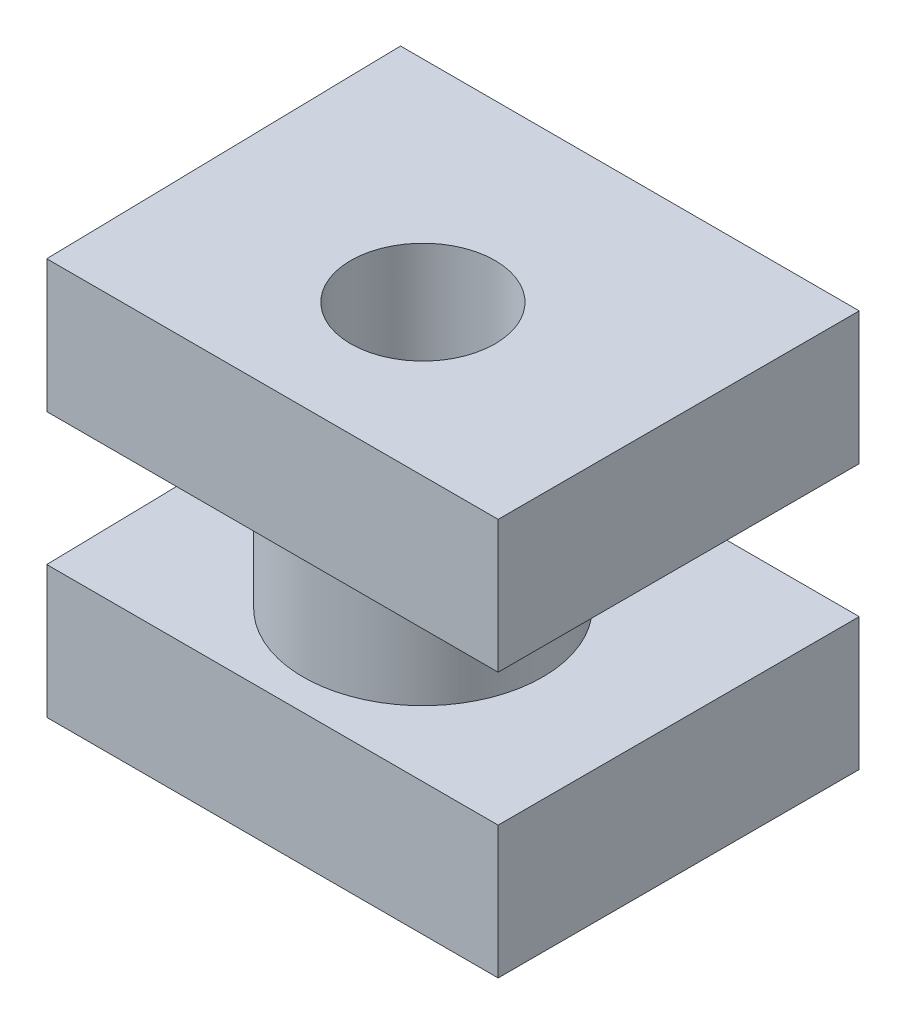
ISO-10303-21;
HEADER;
FILE_DESCRIPTION(('STEP AP214'),'2;1');
FILE_NAME('part.step','',(''),(''),'','','');
FILE_SCHEMA(('AUTOMOTIVE_DESIGN { 1 0 10303 214 1 1 1 1 }'));
ENDSEC;
DATA;
#1=APPLICATION_CONTEXT('core data for automotive mechanical design processes');
#2=APPLICATION_PROTOCOL_DEFINITION('international standard','automotive_design',2000,#1);
#3=PRODUCT_CONTEXT('',#1,'mechanical');
#4=PRODUCT('Part','Part','',(#3));
#5=PRODUCT_RELATED_PRODUCT_CATEGORY('part','',(#4));
#6=PRODUCT_DEFINITION_FORMATION('','',#4);
#7=PRODUCT_DEFINITION_CONTEXT('part definition',#1,'design');
#8=PRODUCT_DEFINITION('design','',#6,#7);
#9=PRODUCT_DEFINITION_SHAPE('','',#8);
#10=(LENGTH_UNIT() NAMED_UNIT(*) SI_UNIT(.MILLI.,.METRE.));
#11=(NAMED_UNIT(*) PLANE_ANGLE_UNIT() SI_UNIT($,.RADIAN.));
#12=(NAMED_UNIT(*) SI_UNIT($,.STERADIAN.) SOLID_ANGLE_UNIT());
#13=UNCERTAINTY_MEASURE_WITH_UNIT(LENGTH_MEASURE(1.E-05),#10,'distance_accuracy_value','');
#14=(GEOMETRIC_REPRESENTATION_CONTEXT(3) GLOBAL_UNCERTAINTY_ASSIGNED_CONTEXT((#13)) GLOBAL_UNIT_ASSIGNED_CONTEXT((#10,
#11,#12)) REPRESENTATION_CONTEXT('',''));
#15=CARTESIAN_POINT('',(0.,0.,0.));
#16=DIRECTION('',(0.,0.,1.));
#17=DIRECTION('',(1.,0.,0.));
#18=AXIS2_PLACEMENT_3D('',#15,#16,#17);
#19=CARTESIAN_POINT('',(-3.9175,2.2,0.252655339965529));
#20=DIRECTION('',(0.,-1.,0.));
#21=DIRECTION('',(0.,0.,-1.));
#22=AXIS2_PLACEMENT_3D('',#19,#20,#21);
#23=CYLINDRICAL_SURFACE('',#22,1.99);
#24=CARTESIAN_POINT('',(-3.9175,0.,0.252655339965529));
#25=DIRECTION('',(0.,1.,0.));
#26=DIRECTION('',(0.,0.,1.));
#27=AXIS2_PLACEMENT_3D('',#24,#25,#26);
#28=CIRCLE('',#27,1.99);
#29=CARTESIAN_POINT('',(-5.035,0.,-1.39394532504102));
#30=VERTEX_POINT('',#29);
#31=CARTESIAN_POINT('',(-2.8,0.,-1.39394532504102));
#32=VERTEX_POINT('',#31);
#33=EDGE_CURVE('E208',#30,#32,#28,.T.);
#34=ORIENTED_EDGE('',*,*,#33,.T.);
#35=DIRECTION('',(0.,-1.,0.));
#36=VECTOR('',#35,1.);
#37=CARTESIAN_POINT('',(-2.8,2.2,-1.39394532504102));
#38=LINE('',#37,#36);
#39=CARTESIAN_POINT('',(-2.8,2.2,-1.39394532504102));
#40=VERTEX_POINT('',#39);
#41=EDGE_CURVE('E11',#40,#32,#38,.T.);
#42=ORIENTED_EDGE('',*,*,#41,.F.);
#43=CARTESIAN_POINT('',(-3.9175,2.2,0.252655339965529));
#44=DIRECTION('',(0.,1.,0.));
#45=DIRECTION('',(0.,0.,1.));
#46=AXIS2_PLACEMENT_3D('',#43,#44,#45);
#47=CIRCLE('',#46,1.99);
#48=CARTESIAN_POINT('',(-5.035,2.2,-1.39394532504102));
#49=VERTEX_POINT('',#48);
#50=EDGE_CURVE('E233',#49,#40,#47,.T.);
#51=ORIENTED_EDGE('',*,*,#50,.F.);
#52=DIRECTION('',(0.,-1.,0.));
#53=VECTOR('',#52,1.);
#54=CARTESIAN_POINT('',(-5.035,2.2,-1.39394532504102));
#55=LINE('',#54,#53);
#56=EDGE_CURVE('E211',#49,#30,#55,.T.);
#57=ORIENTED_EDGE('',*,*,#56,.T.);
#58=EDGE_LOOP('',(#34,#42,#51,#57));
#59=FACE_BOUND('',#58,.T.);
#60=ADVANCED_FACE('F34',(#59),#23,.T.);
#61=CARTESIAN_POINT('',(-2.8,2.2,-3.24734466003447));
#62=DIRECTION('',(-1.,0.,0.));
#63=DIRECTION('',(0.,0.,1.));
#64=AXIS2_PLACEMENT_3D('',#61,#62,#63);
#65=PLANE('',#64);
#66=DIRECTION('',(0.,0.,-1.));
#67=VECTOR('',#66,1.);
#68=CARTESIAN_POINT('',(-2.8,0.,-3.24734466003447));
#69=LINE('',#68,#67);
#70=CARTESIAN_POINT('',(-2.8,0.,-3.24734466003447));
#71=VERTEX_POINT('',#70);
#72=EDGE_CURVE('E214',#32,#71,#69,.T.);
#73=ORIENTED_EDGE('',*,*,#72,.T.);
#74=DIRECTION('',(0.,-1.,0.));
#75=VECTOR('',#74,1.);
#76=CARTESIAN_POINT('',(-2.8,2.2,-3.24734466003447));
#77=LINE('',#76,#75);
#78=CARTESIAN_POINT('',(-2.8,2.2,-3.24734466003447));
#79=VERTEX_POINT('',#78);
#80=EDGE_CURVE('E44',#79,#71,#77,.T.);
#81=ORIENTED_EDGE('',*,*,#80,.F.);
#82=DIRECTION('',(0.,0.,-1.));
#83=VECTOR('',#82,1.);
#84=CARTESIAN_POINT('',(-2.8,2.2,-3.24734466003447));
#85=LINE('',#84,#83);
#86=EDGE_CURVE('E37',#40,#79,#85,.T.);
#87=ORIENTED_EDGE('',*,*,#86,.F.);
#88=ORIENTED_EDGE('',*,*,#41,.T.);
#89=EDGE_LOOP('',(#73,#81,#87,#88));
#90=FACE_BOUND('',#89,.T.);
#91=ADVANCED_FACE('F199',(#90),#65,.F.);
#92=CARTESIAN_POINT('',(-5.035,2.2,-3.24734466003447));
#93=DIRECTION('',(0.,0.,1.));
#94=DIRECTION('',(1.,0.,0.));
#95=AXIS2_PLACEMENT_3D('',#92,#93,#94);
#96=PLANE('',#95);
#97=ORIENTED_EDGE('',*,*,#80,.T.);
#98=DIRECTION('',(1.,0.,0.));
#99=VECTOR('',#98,1.);
#100=CARTESIAN_POINT('',(-3.9175,0.,-3.24734466003447));
#101=LINE('',#100,#99);
#102=CARTESIAN_POINT('',(-0.167500000000001,0.,-3.24734466003447));
#103=VERTEX_POINT('',#102);
#104=EDGE_CURVE('E150',#71,#103,#101,.T.);
#105=ORIENTED_EDGE('',*,*,#104,.T.);
#106=DIRECTION('',(0.,1.,0.));
#107=VECTOR('',#106,1.);
#108=CARTESIAN_POINT('',(-0.167500000000001,-2.2,-3.24734466003447));
#109=LINE('',#108,#107);
#110=CARTESIAN_POINT('',(-0.167500000000001,-2.2,-3.24734466003447));
#111=VERTEX_POINT('',#110);
#112=EDGE_CURVE('E215',#111,#103,#109,.T.);
#113=ORIENTED_EDGE('',*,*,#112,.F.);
#114=DIRECTION('',(1.,0.,0.));
#115=VECTOR('',#114,1.);
#116=CARTESIAN_POINT('',(-3.9175,-2.2,-3.24734466003447));
#117=LINE('',#116,#115);
#118=CARTESIAN_POINT('',(-7.78986155746163,-2.2,-3.24734466003447));
#119=VERTEX_POINT('',#118);
#120=EDGE_CURVE('E261',#119,#111,#117,.T.);
#121=ORIENTED_EDGE('',*,*,#120,.F.);
#122=DIRECTION('',(0.,1.,0.));
#123=VECTOR('',#122,1.);
#124=CARTESIAN_POINT('',(-7.78986155746163,-2.2,-3.24734466003447));
#125=LINE('',#124,#123);
#126=CARTESIAN_POINT('',(-7.78986155746163,0.,-3.24734466003447));
#127=VERTEX_POINT('',#126);
#128=EDGE_CURVE('E262',#119,#127,#125,.T.);
#129=ORIENTED_EDGE('',*,*,#128,.T.);
#130=CARTESIAN_POINT('',(-5.035,0.,-3.24734466003447));
#131=VERTEX_POINT('',#130);
#132=EDGE_CURVE('E247',#127,#131,#101,.T.);
#133=ORIENTED_EDGE('',*,*,#132,.T.);
#134=DIRECTION('',(0.,-1.,0.));
#135=VECTOR('',#134,1.);
#136=CARTESIAN_POINT('',(-5.035,2.2,-3.24734466003447));
#137=LINE('',#136,#135);
#138=CARTESIAN_POINT('',(-5.035,2.2,-3.24734466003447));
#139=VERTEX_POINT('',#138);
#140=EDGE_CURVE('E52',#139,#131,#137,.T.);
#141=ORIENTED_EDGE('',*,*,#140,.F.);
#142=DIRECTION('',(-1.,0.,0.));
#143=VECTOR('',#142,1.);
#144=CARTESIAN_POINT('',(-7.78986155746163,2.2,-3.24734466003447));
#145=LINE('',#144,#143);
#146=CARTESIAN_POINT('',(-7.78986155746163,2.2,-3.24734466003447));
#147=VERTEX_POINT('',#146);
#148=EDGE_CURVE('E159',#139,#147,#145,.T.);
#149=ORIENTED_EDGE('',*,*,#148,.T.);
#150=DIRECTION('',(0.,-1.,0.));
#151=VECTOR('',#150,1.);
#152=CARTESIAN_POINT('',(-7.78986155746163,4.4,-3.24734466003447));
#153=LINE('',#152,#151);
#154=CARTESIAN_POINT('',(-7.78986155746163,4.4,-3.24734466003447));
#155=VERTEX_POINT('',#154);
#156=EDGE_CURVE('E165',#155,#147,#153,.T.);
#157=ORIENTED_EDGE('',*,*,#156,.F.);
#158=DIRECTION('',(-1.,0.,0.));
#159=VECTOR('',#158,1.);
#160=CARTESIAN_POINT('',(-2.8,4.4,-3.24734466003447));
#161=LINE('',#160,#159);
#162=CARTESIAN_POINT('',(-0.167500000000001,4.4,-3.24734466003447));
#163=VERTEX_POINT('',#162);
#164=EDGE_CURVE('E138',#163,#155,#161,.T.);
#165=ORIENTED_EDGE('',*,*,#164,.F.);
#166=DIRECTION('',(0.,-1.,0.));
#167=VECTOR('',#166,1.);
#168=CARTESIAN_POINT('',(-0.167500000000001,4.4,-3.24734466003447));
#169=LINE('',#168,#167);
#170=CARTESIAN_POINT('',(-0.167500000000001,2.2,-3.24734466003447));
#171=VERTEX_POINT('',#170);
#172=EDGE_CURVE('E152',#163,#171,#169,.T.);
#173=ORIENTED_EDGE('',*,*,#172,.T.);
#174=EDGE_CURVE('E142',#171,#79,#145,.T.);
#175=ORIENTED_EDGE('',*,*,#174,.T.);
#176=EDGE_LOOP('',(#97,#105,#113,#121,#129,#133,#141,#149,#157,#165,#173,#175));
#177=FACE_BOUND('',#176,.T.);
#178=ADVANCED_FACE('F170',(#177),#96,.F.);
#179=CARTESIAN_POINT('',(-5.035,2.2,-1.39394532504102));
#180=DIRECTION('',(1.,0.,0.));
#181=DIRECTION('',(0.,0.,-1.));
#182=AXIS2_PLACEMENT_3D('',#179,#180,#181);
#183=PLANE('',#182);
#184=DIRECTION('',(0.,0.,1.));
#185=VECTOR('',#184,1.);
#186=CARTESIAN_POINT('',(-5.035,0.,-1.39394532504102));
#187=LINE('',#186,#185);
#188=EDGE_CURVE('E218',#131,#30,#187,.T.);
#189=ORIENTED_EDGE('',*,*,#188,.T.);
#190=ORIENTED_EDGE('',*,*,#56,.F.);
#191=DIRECTION('',(0.,0.,1.));
#192=VECTOR('',#191,1.);
#193=CARTESIAN_POINT('',(-5.035,2.2,-1.39394532504102));
#194=LINE('',#193,#192);
#195=EDGE_CURVE('E239',#139,#49,#194,.T.);
#196=ORIENTED_EDGE('',*,*,#195,.F.);
#197=ORIENTED_EDGE('',*,*,#140,.T.);
#198=EDGE_LOOP('',(#189,#190,#196,#197));
#199=FACE_BOUND('',#198,.T.);
#200=ADVANCED_FACE('F297',(#199),#183,.F.);
#201=CARTESIAN_POINT('',(-3.9175,2.2,0.252655339965529));
#202=DIRECTION('',(0.,-1.,0.));
#203=DIRECTION('',(0.,0.,-1.));
#204=AXIS2_PLACEMENT_3D('',#201,#202,#203);
#205=CYLINDRICAL_SURFACE('',#204,1.2);
#206=CARTESIAN_POINT('',(-3.9175,-2.2,0.252655339965529));
#207=DIRECTION('',(0.,-1.,0.));
#208=DIRECTION('',(0.,0.,-1.));
#209=AXIS2_PLACEMENT_3D('',#206,#207,#208);
#210=CIRCLE('',#209,1.2);
#211=CARTESIAN_POINT('',(-3.9175,-2.2,-0.947344660034471));
#212=VERTEX_POINT('',#211);
#213=EDGE_CURVE('E147',#212,#212,#210,.T.);
#214=ORIENTED_EDGE('',*,*,#213,.T.);
#215=EDGE_LOOP('',(#214));
#216=FACE_BOUND('',#215,.T.);
#217=CARTESIAN_POINT('',(-3.9175,4.4,0.252655339965529));
#218=DIRECTION('',(0.,1.,0.));
#219=DIRECTION('',(0.,0.,1.));
#220=AXIS2_PLACEMENT_3D('',#217,#218,#219);
#221=CIRCLE('',#220,1.2);
#222=CARTESIAN_POINT('',(-3.9175,4.4,1.45265533996553));
#223=VERTEX_POINT('',#222);
#224=EDGE_CURVE('E177',#223,#223,#221,.T.);
#225=ORIENTED_EDGE('',*,*,#224,.T.);
#226=EDGE_LOOP('',(#225));
#227=FACE_BOUND('',#226,.T.);
#228=ADVANCED_FACE('F185',(#216,#227),#205,.F.);
#229=CARTESIAN_POINT('',(0.,0.,0.));
#230=DIRECTION('',(0.,1.,0.));
#231=DIRECTION('',(0.,0.,1.));
#232=AXIS2_PLACEMENT_3D('',#229,#230,#231);
#233=PLANE('',#232);
#234=ORIENTED_EDGE('',*,*,#188,.F.);
#235=ORIENTED_EDGE('',*,*,#132,.F.);
#236=DIRECTION('',(-0.0203893533989371,0.,-0.999792115526009));
#237=VECTOR('',#236,1.);
#238=CARTESIAN_POINT('',(-7.6675,0.,2.75265533996553));
#239=LINE('',#238,#237);
#240=CARTESIAN_POINT('',(-7.6675,0.,2.75265533996553));
#241=VERTEX_POINT('',#240);
#242=EDGE_CURVE('E258',#241,#127,#239,.T.);
#243=ORIENTED_EDGE('',*,*,#242,.F.);
#244=DIRECTION('',(-1.,0.,0.));
#245=VECTOR('',#244,1.);
#246=CARTESIAN_POINT('',(-0.167500000000001,0.,2.75265533996553));
#247=LINE('',#246,#245);
#248=CARTESIAN_POINT('',(-0.167500000000001,0.,2.75265533996553));
#249=VERTEX_POINT('',#248);
#250=EDGE_CURVE('E256',#249,#241,#247,.T.);
#251=ORIENTED_EDGE('',*,*,#250,.F.);
#252=DIRECTION('',(0.,0.,1.));
#253=VECTOR('',#252,1.);
#254=CARTESIAN_POINT('',(-0.167500000000001,0.,-3.24734466003447));
#255=LINE('',#254,#253);
#256=EDGE_CURVE('E253',#103,#249,#255,.T.);
#257=ORIENTED_EDGE('',*,*,#256,.F.);
#258=ORIENTED_EDGE('',*,*,#104,.F.);
#259=ORIENTED_EDGE('',*,*,#72,.F.);
#260=ORIENTED_EDGE('',*,*,#33,.F.);
#261=EDGE_LOOP('',(#234,#235,#243,#251,#257,#258,#259,#260));
#262=FACE_BOUND('',#261,.T.);
#263=ADVANCED_FACE('F279',(#262),#233,.T.);
#264=CARTESIAN_POINT('',(0.,-2.2,0.));
#265=DIRECTION('',(0.,1.,0.));
#266=DIRECTION('',(0.,0.,1.));
#267=AXIS2_PLACEMENT_3D('',#264,#265,#266);
#268=PLANE('',#267);
#269=ORIENTED_EDGE('',*,*,#120,.T.);
#270=DIRECTION('',(0.,0.,1.));
#271=VECTOR('',#270,1.);
#272=CARTESIAN_POINT('',(-0.167500000000001,-2.2,-3.24734466003447));
#273=LINE('',#272,#271);
#274=CARTESIAN_POINT('',(-0.167500000000001,-2.2,2.75265533996553));
#275=VERTEX_POINT('',#274);
#276=EDGE_CURVE('E286',#111,#275,#273,.T.);
#277=ORIENTED_EDGE('',*,*,#276,.T.);
#278=DIRECTION('',(-1.,0.,0.));
#279=VECTOR('',#278,1.);
#280=CARTESIAN_POINT('',(-0.167500000000001,-2.2,2.75265533996553));
#281=LINE('',#280,#279);
#282=CARTESIAN_POINT('',(-7.6675,-2.2,2.75265533996553));
#283=VERTEX_POINT('',#282);
#284=EDGE_CURVE('E274',#275,#283,#281,.T.);
#285=ORIENTED_EDGE('',*,*,#284,.T.);
#286=DIRECTION('',(-0.0203893533989371,0.,-0.999792115526009));
#287=VECTOR('',#286,1.);
#288=CARTESIAN_POINT('',(-7.6675,-2.2,2.75265533996553));
#289=LINE('',#288,#287);
#290=EDGE_CURVE('E251',#283,#119,#289,.T.);
#291=ORIENTED_EDGE('',*,*,#290,.T.);
#292=EDGE_LOOP('',(#269,#277,#285,#291));
#293=FACE_BOUND('',#292,.T.);
#294=ORIENTED_EDGE('',*,*,#213,.F.);
#295=EDGE_LOOP('',(#294));
#296=FACE_BOUND('',#295,.T.);
#297=ADVANCED_FACE('F289',(#293,#296),#268,.F.);
#298=CARTESIAN_POINT('',(-0.167500000000001,-2.2,-3.24734466003447));
#299=DIRECTION('',(-1.,0.,0.));
#300=DIRECTION('',(0.,0.,1.));
#301=AXIS2_PLACEMENT_3D('',#298,#299,#300);
#302=PLANE('',#301);
#303=ORIENTED_EDGE('',*,*,#256,.T.);
#304=DIRECTION('',(0.,1.,0.));
#305=VECTOR('',#304,1.);
#306=CARTESIAN_POINT('',(-0.167500000000001,-2.2,2.75265533996553));
#307=LINE('',#306,#305);
#308=EDGE_CURVE('E221',#275,#249,#307,.T.);
#309=ORIENTED_EDGE('',*,*,#308,.F.);
#310=ORIENTED_EDGE('',*,*,#276,.F.);
#311=ORIENTED_EDGE('',*,*,#112,.T.);
#312=EDGE_LOOP('',(#303,#309,#310,#311));
#313=FACE_BOUND('',#312,.T.);
#314=ADVANCED_FACE('F292',(#313),#302,.F.);
#315=CARTESIAN_POINT('',(-0.167500000000001,-2.2,2.75265533996553));
#316=DIRECTION('',(0.,0.,-1.));
#317=DIRECTION('',(-1.,0.,0.));
#318=AXIS2_PLACEMENT_3D('',#315,#316,#317);
#319=PLANE('',#318);
#320=ORIENTED_EDGE('',*,*,#250,.T.);
#321=DIRECTION('',(0.,1.,0.));
#322=VECTOR('',#321,1.);
#323=CARTESIAN_POINT('',(-7.6675,-2.2,2.75265533996553));
#324=LINE('',#323,#322);
#325=EDGE_CURVE('E265',#283,#241,#324,.T.);
#326=ORIENTED_EDGE('',*,*,#325,.F.);
#327=ORIENTED_EDGE('',*,*,#284,.F.);
#328=ORIENTED_EDGE('',*,*,#308,.T.);
#329=EDGE_LOOP('',(#320,#326,#327,#328));
#330=FACE_BOUND('',#329,.T.);
#331=ADVANCED_FACE('F195',(#330),#319,.F.);
#332=CARTESIAN_POINT('',(-7.6675,-2.2,2.75265533996553));
#333=DIRECTION('',(0.999792115526009,0.,-0.0203893533989371));
#334=DIRECTION('',(-0.0203893533989371,0.,-0.999792115526009));
#335=AXIS2_PLACEMENT_3D('',#332,#333,#334);
#336=PLANE('',#335);
#337=ORIENTED_EDGE('',*,*,#242,.T.);
#338=ORIENTED_EDGE('',*,*,#128,.F.);
#339=ORIENTED_EDGE('',*,*,#290,.F.);
#340=ORIENTED_EDGE('',*,*,#325,.T.);
#341=EDGE_LOOP('',(#337,#338,#339,#340));
#342=FACE_BOUND('',#341,.T.);
#343=ADVANCED_FACE('F188',(#342),#336,.F.);
#344=CARTESIAN_POINT('',(0.,4.4,0.));
#345=DIRECTION('',(0.,-1.,0.));
#346=DIRECTION('',(0.,0.,-1.));
#347=AXIS2_PLACEMENT_3D('',#344,#345,#346);
#348=PLANE('',#347);
#349=DIRECTION('',(0.0203893533989371,0.,0.999792115526009));
#350=VECTOR('',#349,1.);
#351=CARTESIAN_POINT('',(-7.6675,4.4,2.75265533996553));
#352=LINE('',#351,#350);
#353=CARTESIAN_POINT('',(-7.6675,4.4,2.75265533996553));
#354=VERTEX_POINT('',#353);
#355=EDGE_CURVE('E132',#155,#354,#352,.T.);
#356=ORIENTED_EDGE('',*,*,#355,.T.);
#357=DIRECTION('',(1.,0.,0.));
#358=VECTOR('',#357,1.);
#359=CARTESIAN_POINT('',(-0.167500000000001,4.4,2.75265533996553));
#360=LINE('',#359,#358);
#361=CARTESIAN_POINT('',(-0.167500000000001,4.4,2.75265533996553));
#362=VERTEX_POINT('',#361);
#363=EDGE_CURVE('E121',#354,#362,#360,.T.);
#364=ORIENTED_EDGE('',*,*,#363,.T.);
#365=DIRECTION('',(0.,0.,-1.));
#366=VECTOR('',#365,1.);
#367=CARTESIAN_POINT('',(-0.167500000000001,4.4,-3.24734466003447));
#368=LINE('',#367,#366);
#369=EDGE_CURVE('E131',#362,#163,#368,.T.);
#370=ORIENTED_EDGE('',*,*,#369,.T.);
#371=ORIENTED_EDGE('',*,*,#164,.T.);
#372=EDGE_LOOP('',(#356,#364,#370,#371));
#373=FACE_BOUND('',#372,.T.);
#374=ORIENTED_EDGE('',*,*,#224,.F.);
#375=EDGE_LOOP('',(#374));
#376=FACE_BOUND('',#375,.T.);
#377=ADVANCED_FACE('F135',(#373,#376),#348,.F.);
#378=CARTESIAN_POINT('',(0.,2.2,0.));
#379=DIRECTION('',(0.,-1.,0.));
#380=DIRECTION('',(0.,0.,-1.));
#381=AXIS2_PLACEMENT_3D('',#378,#379,#380);
#382=PLANE('',#381);
#383=ORIENTED_EDGE('',*,*,#50,.T.);
#384=ORIENTED_EDGE('',*,*,#86,.T.);
#385=ORIENTED_EDGE('',*,*,#174,.F.);
#386=DIRECTION('',(0.,0.,-1.));
#387=VECTOR('',#386,1.);
#388=CARTESIAN_POINT('',(-0.167500000000001,2.2,-3.24734466003447));
#389=LINE('',#388,#387);
#390=CARTESIAN_POINT('',(-0.167500000000001,2.2,2.75265533996553));
#391=VERTEX_POINT('',#390);
#392=EDGE_CURVE('E163',#391,#171,#389,.T.);
#393=ORIENTED_EDGE('',*,*,#392,.F.);
#394=DIRECTION('',(1.,0.,0.));
#395=VECTOR('',#394,1.);
#396=CARTESIAN_POINT('',(-0.167500000000001,2.2,2.75265533996553));
#397=LINE('',#396,#395);
#398=CARTESIAN_POINT('',(-7.6675,2.2,2.75265533996553));
#399=VERTEX_POINT('',#398);
#400=EDGE_CURVE('E176',#399,#391,#397,.T.);
#401=ORIENTED_EDGE('',*,*,#400,.F.);
#402=DIRECTION('',(0.0203893533989371,0.,0.999792115526009));
#403=VECTOR('',#402,1.);
#404=CARTESIAN_POINT('',(-7.6675,2.2,2.75265533996553));
#405=LINE('',#404,#403);
#406=EDGE_CURVE('E146',#147,#399,#405,.T.);
#407=ORIENTED_EDGE('',*,*,#406,.F.);
#408=ORIENTED_EDGE('',*,*,#148,.F.);
#409=ORIENTED_EDGE('',*,*,#195,.T.);
#410=EDGE_LOOP('',(#383,#384,#385,#393,#401,#407,#408,#409));
#411=FACE_BOUND('',#410,.T.);
#412=ADVANCED_FACE('F187',(#411),#382,.T.);
#413=CARTESIAN_POINT('',(-7.6675,4.4,2.75265533996553));
#414=DIRECTION('',(0.999792115526009,0.,-0.0203893533989371));
#415=DIRECTION('',(-0.0203893533989371,0.,-0.999792115526009));
#416=AXIS2_PLACEMENT_3D('',#413,#414,#415);
#417=PLANE('',#416);
#418=ORIENTED_EDGE('',*,*,#406,.T.);
#419=DIRECTION('',(0.,-1.,0.));
#420=VECTOR('',#419,1.);
#421=CARTESIAN_POINT('',(-7.6675,4.4,2.75265533996553));
#422=LINE('',#421,#420);
#423=EDGE_CURVE('E125',#354,#399,#422,.T.);
#424=ORIENTED_EDGE('',*,*,#423,.F.);
#425=ORIENTED_EDGE('',*,*,#355,.F.);
#426=ORIENTED_EDGE('',*,*,#156,.T.);
#427=EDGE_LOOP('',(#418,#424,#425,#426));
#428=FACE_BOUND('',#427,.T.);
#429=ADVANCED_FACE('F144',(#428),#417,.F.);
#430=CARTESIAN_POINT('',(-0.167500000000001,4.4,2.75265533996553));
#431=DIRECTION('',(0.,0.,-1.));
#432=DIRECTION('',(-1.,0.,0.));
#433=AXIS2_PLACEMENT_3D('',#430,#431,#432);
#434=PLANE('',#433);
#435=ORIENTED_EDGE('',*,*,#400,.T.);
#436=DIRECTION('',(0.,-1.,0.));
#437=VECTOR('',#436,1.);
#438=CARTESIAN_POINT('',(-0.167500000000001,4.4,2.75265533996553));
#439=LINE('',#438,#437);
#440=EDGE_CURVE('E128',#362,#391,#439,.T.);
#441=ORIENTED_EDGE('',*,*,#440,.F.);
#442=ORIENTED_EDGE('',*,*,#363,.F.);
#443=ORIENTED_EDGE('',*,*,#423,.T.);
#444=EDGE_LOOP('',(#435,#441,#442,#443));
#445=FACE_BOUND('',#444,.T.);
#446=ADVANCED_FACE('F123',(#445),#434,.F.);
#447=CARTESIAN_POINT('',(-0.167500000000001,4.4,-3.24734466003447));
#448=DIRECTION('',(-1.,0.,0.));
#449=DIRECTION('',(0.,0.,1.));
#450=AXIS2_PLACEMENT_3D('',#447,#448,#449);
#451=PLANE('',#450);
#452=ORIENTED_EDGE('',*,*,#392,.T.);
#453=ORIENTED_EDGE('',*,*,#172,.F.);
#454=ORIENTED_EDGE('',*,*,#369,.F.);
#455=ORIENTED_EDGE('',*,*,#440,.T.);
#456=EDGE_LOOP('',(#452,#453,#454,#455));
#457=FACE_BOUND('',#456,.T.);
#458=ADVANCED_FACE('F173',(#457),#451,.F.);
#459=CLOSED_SHELL('',(#60,#91,#178,#200,#228,#263,#297,#314,#331,#343,#377,#412,#429,#446,#458));
#460=MANIFOLD_SOLID_BREP('B2',#459);
#461=ADVANCED_BREP_SHAPE_REPRESENTATION('',(#18,#460),#14);
#462=SHAPE_DEFINITION_REPRESENTATION(#9,#461);
ENDSEC;
END-ISO-10303-21;
